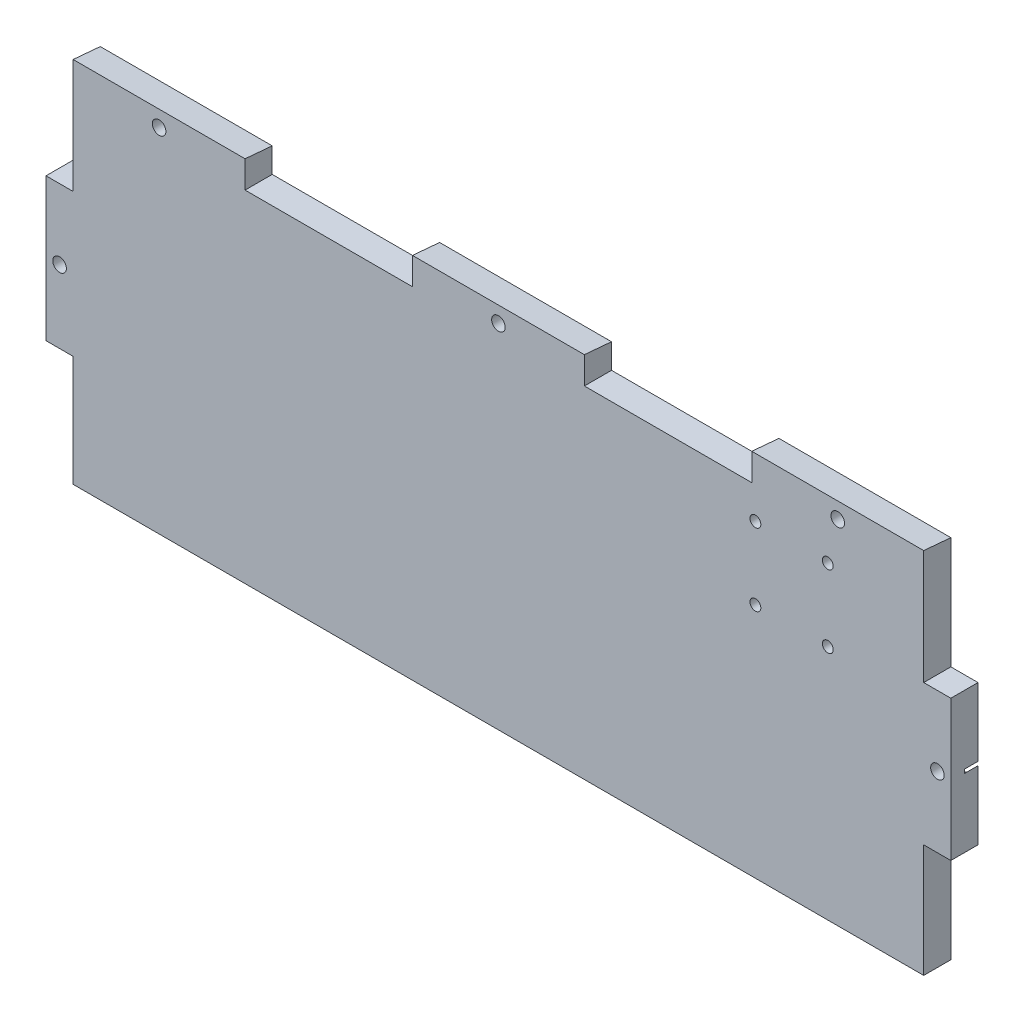
ISO-10303-21;
HEADER;
FILE_DESCRIPTION(('STEP AP214'),'2;1');
FILE_NAME('part.step','',(''),(''),'','','');
FILE_SCHEMA(('AUTOMOTIVE_DESIGN { 1 0 10303 214 1 1 1 1 }'));
ENDSEC;
DATA;
#1=APPLICATION_CONTEXT('core data for automotive mechanical design processes');
#2=APPLICATION_PROTOCOL_DEFINITION('international standard','automotive_design',2000,#1);
#3=PRODUCT_CONTEXT('',#1,'mechanical');
#4=PRODUCT('Part','Part','',(#3));
#5=PRODUCT_RELATED_PRODUCT_CATEGORY('part','',(#4));
#6=PRODUCT_DEFINITION_FORMATION('','',#4);
#7=PRODUCT_DEFINITION_CONTEXT('part definition',#1,'design');
#8=PRODUCT_DEFINITION('design','',#6,#7);
#9=PRODUCT_DEFINITION_SHAPE('','',#8);
#10=(LENGTH_UNIT() NAMED_UNIT(*) SI_UNIT(.MILLI.,.METRE.));
#11=(NAMED_UNIT(*) PLANE_ANGLE_UNIT() SI_UNIT($,.RADIAN.));
#12=(NAMED_UNIT(*) SI_UNIT($,.STERADIAN.) SOLID_ANGLE_UNIT());
#13=UNCERTAINTY_MEASURE_WITH_UNIT(LENGTH_MEASURE(1.E-05),#10,'distance_accuracy_value','');
#14=(GEOMETRIC_REPRESENTATION_CONTEXT(3) GLOBAL_UNCERTAINTY_ASSIGNED_CONTEXT((#13)) GLOBAL_UNIT_ASSIGNED_CONTEXT((#10,
#11,#12)) REPRESENTATION_CONTEXT('',''));
#15=CARTESIAN_POINT('',(0.,0.,0.));
#16=DIRECTION('',(0.,0.,1.));
#17=DIRECTION('',(1.,0.,0.));
#18=AXIS2_PLACEMENT_3D('',#15,#16,#17);
#19=CARTESIAN_POINT('',(-679.157205454483,81.33,6.));
#20=DIRECTION('',(0.,-0.996194698091746,0.0871557427476549));
#21=DIRECTION('',(0.,-0.0871557427476549,-0.996194698091746));
#22=AXIS2_PLACEMENT_3D('',#19,#20,#21);
#23=PLANE('',#22);
#24=DIRECTION('',(-1.,0.,0.));
#25=VECTOR('',#24,1.);
#26=CARTESIAN_POINT('',(0.,81.33,6.));
#27=LINE('',#26,#25);
#28=CARTESIAN_POINT('',(-75.,81.33,6.));
#29=VERTEX_POINT('',#28);
#30=CARTESIAN_POINT('',(-113.,81.33,6.));
#31=VERTEX_POINT('',#30);
#32=EDGE_CURVE('E435',#29,#31,#27,.T.);
#33=ORIENTED_EDGE('',*,*,#32,.F.);
#34=DIRECTION('',(0.,-0.0871557427476549,-0.996194698091746));
#35=VECTOR('',#34,1.);
#36=CARTESIAN_POINT('',(-75.,81.33,6.));
#37=LINE('',#36,#35);
#38=CARTESIAN_POINT('',(-75.,80.8050680188445,0.));
#39=VERTEX_POINT('',#38);
#40=EDGE_CURVE('E258',#29,#39,#37,.T.);
#41=ORIENTED_EDGE('',*,*,#40,.T.);
#42=DIRECTION('',(1.,0.,0.));
#43=VECTOR('',#42,1.);
#44=CARTESIAN_POINT('',(0.,80.8050680188444,0.));
#45=LINE('',#44,#43);
#46=CARTESIAN_POINT('',(-113.,80.8050680188445,0.));
#47=VERTEX_POINT('',#46);
#48=EDGE_CURVE('E454',#47,#39,#45,.T.);
#49=ORIENTED_EDGE('',*,*,#48,.F.);
#50=DIRECTION('',(0.,0.0871557427476549,0.996194698091746));
#51=VECTOR('',#50,1.);
#52=CARTESIAN_POINT('',(-113.,81.33,6.));
#53=LINE('',#52,#51);
#54=EDGE_CURVE('E249',#47,#31,#53,.T.);
#55=ORIENTED_EDGE('',*,*,#54,.T.);
#56=EDGE_LOOP('',(#33,#41,#49,#55));
#57=FACE_BOUND('',#56,.T.);
#58=ADVANCED_FACE('F35',(#57),#23,.F.);
#59=CARTESIAN_POINT('',(-150.,81.33,6.));
#60=VERTEX_POINT('',#59);
#61=CARTESIAN_POINT('',(-188.,81.33,6.));
#62=VERTEX_POINT('',#61);
#63=EDGE_CURVE('E436',#60,#62,#27,.T.);
#64=ORIENTED_EDGE('',*,*,#63,.F.);
#65=DIRECTION('',(0.,-0.0871557427476549,-0.996194698091746));
#66=VECTOR('',#65,1.);
#67=CARTESIAN_POINT('',(-150.,81.33,6.00000000000021));
#68=LINE('',#67,#66);
#69=CARTESIAN_POINT('',(-150.,80.8050680188445,0.));
#70=VERTEX_POINT('',#69);
#71=EDGE_CURVE('E252',#60,#70,#68,.T.);
#72=ORIENTED_EDGE('',*,*,#71,.T.);
#73=CARTESIAN_POINT('',(-188.,80.8050680188445,0.));
#74=VERTEX_POINT('',#73);
#75=EDGE_CURVE('E253',#74,#70,#45,.T.);
#76=ORIENTED_EDGE('',*,*,#75,.F.);
#77=DIRECTION('',(0.,-0.0871557427476549,-0.996194698091746));
#78=VECTOR('',#77,1.);
#79=CARTESIAN_POINT('',(-188.,80.7122072762415,-1.06140314482546));
#80=LINE('',#79,#78);
#81=EDGE_CURVE('E464',#62,#74,#80,.T.);
#82=ORIENTED_EDGE('',*,*,#81,.F.);
#83=EDGE_LOOP('',(#64,#72,#76,#82));
#84=FACE_BOUND('',#83,.T.);
#85=ADVANCED_FACE('F512',(#84),#23,.F.);
#86=CARTESIAN_POINT('',(0.,0.,6.));
#87=DIRECTION('',(-1.,0.,0.));
#88=DIRECTION('',(0.,0.,1.));
#89=AXIS2_PLACEMENT_3D('',#86,#87,#88);
#90=PLANE('',#89);
#91=DIRECTION('',(0.,0.,1.));
#92=VECTOR('',#91,1.);
#93=CARTESIAN_POINT('',(0.,56.0675340094222,6.));
#94=LINE('',#93,#92);
#95=CARTESIAN_POINT('',(0.,56.0675340094222,0.));
#96=VERTEX_POINT('',#95);
#97=CARTESIAN_POINT('',(0.,56.0675340094222,6.));
#98=VERTEX_POINT('',#97);
#99=EDGE_CURVE('E224',#96,#98,#94,.T.);
#100=ORIENTED_EDGE('',*,*,#99,.F.);
#101=DIRECTION('',(0.,1.,0.));
#102=VECTOR('',#101,1.);
#103=CARTESIAN_POINT('',(0.,0.,0.));
#104=LINE('',#103,#102);
#105=CARTESIAN_POINT('',(0.,80.8050680188444,0.));
#106=VERTEX_POINT('',#105);
#107=EDGE_CURVE('E402',#96,#106,#104,.T.);
#108=ORIENTED_EDGE('',*,*,#107,.T.);
#109=DIRECTION('',(0.,0.0871557427476549,0.996194698091746));
#110=VECTOR('',#109,1.);
#111=CARTESIAN_POINT('',(0.,80.7122072762415,-1.06140314482546));
#112=LINE('',#111,#110);
#113=CARTESIAN_POINT('',(0.,81.33,6.));
#114=VERTEX_POINT('',#113);
#115=EDGE_CURVE('E407',#106,#114,#112,.T.);
#116=ORIENTED_EDGE('',*,*,#115,.T.);
#117=DIRECTION('',(0.,1.,0.));
#118=VECTOR('',#117,1.);
#119=CARTESIAN_POINT('',(0.,0.,6.));
#120=LINE('',#119,#118);
#121=EDGE_CURVE('E226',#98,#114,#120,.T.);
#122=ORIENTED_EDGE('',*,*,#121,.F.);
#123=EDGE_LOOP('',(#100,#108,#116,#122));
#124=FACE_BOUND('',#123,.T.);
#125=ADVANCED_FACE('F37',(#124),#90,.F.);
#126=DIRECTION('',(0.,0.,-1.));
#127=VECTOR('',#126,1.);
#128=CARTESIAN_POINT('',(0.,25.,6.));
#129=LINE('',#128,#127);
#130=CARTESIAN_POINT('',(0.,25.,6.));
#131=VERTEX_POINT('',#130);
#132=CARTESIAN_POINT('',(0.,25.,0.));
#133=VERTEX_POINT('',#132);
#134=EDGE_CURVE('E220',#131,#133,#129,.T.);
#135=ORIENTED_EDGE('',*,*,#134,.F.);
#136=CARTESIAN_POINT('',(0.,0.,6.));
#137=VERTEX_POINT('',#136);
#138=EDGE_CURVE('E391',#137,#131,#120,.T.);
#139=ORIENTED_EDGE('',*,*,#138,.F.);
#140=DIRECTION('',(0.,0.,-1.));
#141=VECTOR('',#140,1.);
#142=CARTESIAN_POINT('',(0.,0.,6.));
#143=LINE('',#142,#141);
#144=CARTESIAN_POINT('',(0.,0.,0.));
#145=VERTEX_POINT('',#144);
#146=EDGE_CURVE('E447',#137,#145,#143,.T.);
#147=ORIENTED_EDGE('',*,*,#146,.T.);
#148=EDGE_CURVE('E396',#145,#133,#104,.T.);
#149=ORIENTED_EDGE('',*,*,#148,.T.);
#150=EDGE_LOOP('',(#135,#139,#147,#149));
#151=FACE_BOUND('',#150,.T.);
#152=ADVANCED_FACE('F450',(#151),#90,.F.);
#153=CARTESIAN_POINT('',(-188.,0.,6.));
#154=DIRECTION('',(1.,0.,0.));
#155=DIRECTION('',(0.,0.,-1.));
#156=AXIS2_PLACEMENT_3D('',#153,#154,#155);
#157=PLANE('',#156);
#158=DIRECTION('',(0.,0.,1.));
#159=VECTOR('',#158,1.);
#160=CARTESIAN_POINT('',(-188.,24.5,6.));
#161=LINE('',#160,#159);
#162=CARTESIAN_POINT('',(-188.,24.5,0.));
#163=VERTEX_POINT('',#162);
#164=CARTESIAN_POINT('',(-188.,24.5,6.));
#165=VERTEX_POINT('',#164);
#166=EDGE_CURVE('E479',#163,#165,#161,.T.);
#167=ORIENTED_EDGE('',*,*,#166,.F.);
#168=DIRECTION('',(0.,-1.,0.));
#169=VECTOR('',#168,1.);
#170=CARTESIAN_POINT('',(-188.,0.,0.));
#171=LINE('',#170,#169);
#172=CARTESIAN_POINT('',(-188.,0.,0.));
#173=VERTEX_POINT('',#172);
#174=EDGE_CURVE('E401',#163,#173,#171,.T.);
#175=ORIENTED_EDGE('',*,*,#174,.T.);
#176=DIRECTION('',(0.,0.,-1.));
#177=VECTOR('',#176,1.);
#178=CARTESIAN_POINT('',(-188.,0.,6.));
#179=LINE('',#178,#177);
#180=CARTESIAN_POINT('',(-188.,0.,6.));
#181=VERTEX_POINT('',#180);
#182=EDGE_CURVE('E449',#181,#173,#179,.T.);
#183=ORIENTED_EDGE('',*,*,#182,.F.);
#184=DIRECTION('',(0.,-1.,0.));
#185=VECTOR('',#184,1.);
#186=CARTESIAN_POINT('',(-188.,0.,6.));
#187=LINE('',#186,#185);
#188=EDGE_CURVE('E426',#165,#181,#187,.T.);
#189=ORIENTED_EDGE('',*,*,#188,.F.);
#190=EDGE_LOOP('',(#167,#175,#183,#189));
#191=FACE_BOUND('',#190,.T.);
#192=ADVANCED_FACE('F566',(#191),#157,.F.);
#193=DIRECTION('',(0.,0.,-1.));
#194=VECTOR('',#193,1.);
#195=CARTESIAN_POINT('',(-188.,56.0675340094222,6.));
#196=LINE('',#195,#194);
#197=CARTESIAN_POINT('',(-188.,56.0675340094222,6.));
#198=VERTEX_POINT('',#197);
#199=CARTESIAN_POINT('',(-188.,56.0675340094222,0.));
#200=VERTEX_POINT('',#199);
#201=EDGE_CURVE('E237',#198,#200,#196,.T.);
#202=ORIENTED_EDGE('',*,*,#201,.F.);
#203=EDGE_CURVE('E428',#62,#198,#187,.T.);
#204=ORIENTED_EDGE('',*,*,#203,.F.);
#205=ORIENTED_EDGE('',*,*,#81,.T.);
#206=EDGE_CURVE('E404',#74,#200,#171,.T.);
#207=ORIENTED_EDGE('',*,*,#206,.T.);
#208=EDGE_LOOP('',(#202,#204,#205,#207));
#209=FACE_BOUND('',#208,.T.);
#210=ADVANCED_FACE('F506',(#209),#157,.F.);
#211=CARTESIAN_POINT('',(0.,0.,6.));
#212=DIRECTION('',(0.,1.,0.));
#213=DIRECTION('',(-1.,0.,0.));
#214=AXIS2_PLACEMENT_3D('',#211,#212,#213);
#215=PLANE('',#214);
#216=DIRECTION('',(1.,0.,0.));
#217=VECTOR('',#216,1.);
#218=CARTESIAN_POINT('',(0.,0.,0.));
#219=LINE('',#218,#217);
#220=EDGE_CURVE('E398',#173,#145,#219,.T.);
#221=ORIENTED_EDGE('',*,*,#220,.T.);
#222=ORIENTED_EDGE('',*,*,#146,.F.);
#223=DIRECTION('',(1.,0.,0.));
#224=VECTOR('',#223,1.);
#225=CARTESIAN_POINT('',(0.,0.,6.));
#226=LINE('',#225,#224);
#227=EDGE_CURVE('E416',#181,#137,#226,.T.);
#228=ORIENTED_EDGE('',*,*,#227,.F.);
#229=ORIENTED_EDGE('',*,*,#182,.T.);
#230=EDGE_LOOP('',(#221,#222,#228,#229));
#231=FACE_BOUND('',#230,.T.);
#232=ADVANCED_FACE('F445',(#231),#215,.F.);
#233=CARTESIAN_POINT('',(0.,0.,6.));
#234=DIRECTION('',(0.,0.,1.));
#235=DIRECTION('',(1.,0.,0.));
#236=AXIS2_PLACEMENT_3D('',#233,#234,#235);
#237=PLANE('',#236);
#238=CARTESIAN_POINT('',(-37.2,52.33,6.));
#239=DIRECTION('',(0.,0.,1.));
#240=DIRECTION('',(1.,0.,0.));
#241=AXIS2_PLACEMENT_3D('',#238,#239,#240);
#242=CIRCLE('',#241,1.2);
#243=CARTESIAN_POINT('',(-36.,52.33,6.));
#244=VERTEX_POINT('',#243);
#245=EDGE_CURVE('E301',#244,#244,#242,.T.);
#246=ORIENTED_EDGE('',*,*,#245,.F.);
#247=EDGE_LOOP('',(#246));
#248=FACE_BOUND('',#247,.T.);
#249=CARTESIAN_POINT('',(-37.2,68.33,6.));
#250=DIRECTION('',(0.,0.,1.));
#251=DIRECTION('',(1.,0.,0.));
#252=AXIS2_PLACEMENT_3D('',#249,#250,#251);
#253=CIRCLE('',#252,1.2);
#254=CARTESIAN_POINT('',(-36.,68.33,6.));
#255=VERTEX_POINT('',#254);
#256=EDGE_CURVE('E291',#255,#255,#253,.T.);
#257=ORIENTED_EDGE('',*,*,#256,.F.);
#258=EDGE_LOOP('',(#257));
#259=FACE_BOUND('',#258,.T.);
#260=CARTESIAN_POINT('',(-21.2,52.33,6.));
#261=DIRECTION('',(0.,0.,1.));
#262=DIRECTION('',(1.,0.,0.));
#263=AXIS2_PLACEMENT_3D('',#260,#261,#262);
#264=CIRCLE('',#263,1.2);
#265=CARTESIAN_POINT('',(-20.,52.33,6.));
#266=VERTEX_POINT('',#265);
#267=EDGE_CURVE('E288',#266,#266,#264,.T.);
#268=ORIENTED_EDGE('',*,*,#267,.F.);
#269=EDGE_LOOP('',(#268));
#270=FACE_BOUND('',#269,.T.);
#271=CARTESIAN_POINT('',(-21.2,68.33,6.));
#272=DIRECTION('',(0.,0.,1.));
#273=DIRECTION('',(1.,0.,0.));
#274=AXIS2_PLACEMENT_3D('',#271,#272,#273);
#275=CIRCLE('',#274,1.20000000000001);
#276=CARTESIAN_POINT('',(-20.,68.33,6.));
#277=VERTEX_POINT('',#276);
#278=EDGE_CURVE('E285',#277,#277,#275,.T.);
#279=ORIENTED_EDGE('',*,*,#278,.F.);
#280=EDGE_LOOP('',(#279));
#281=FACE_BOUND('',#280,.T.);
#282=CARTESIAN_POINT('',(-191.,40.5675340094222,6.));
#283=DIRECTION('',(0.,0.,-1.));
#284=DIRECTION('',(-1.,0.,0.));
#285=AXIS2_PLACEMENT_3D('',#282,#283,#284);
#286=CIRCLE('',#285,1.5);
#287=CARTESIAN_POINT('',(-192.5,40.5675340094222,6.));
#288=VERTEX_POINT('',#287);
#289=EDGE_CURVE('E281',#288,#288,#286,.T.);
#290=ORIENTED_EDGE('',*,*,#289,.T.);
#291=EDGE_LOOP('',(#290));
#292=FACE_BOUND('',#291,.T.);
#293=CARTESIAN_POINT('',(-169.,77.8050680188445,6.));
#294=DIRECTION('',(0.,0.,-1.));
#295=DIRECTION('',(-1.,0.,0.));
#296=AXIS2_PLACEMENT_3D('',#293,#294,#295);
#297=CIRCLE('',#296,1.5);
#298=CARTESIAN_POINT('',(-170.5,77.8050680188445,6.));
#299=VERTEX_POINT('',#298);
#300=EDGE_CURVE('E277',#299,#299,#297,.T.);
#301=ORIENTED_EDGE('',*,*,#300,.T.);
#302=EDGE_LOOP('',(#301));
#303=FACE_BOUND('',#302,.T.);
#304=CARTESIAN_POINT('',(-94.,77.8050680188445,6.));
#305=DIRECTION('',(0.,0.,-1.));
#306=DIRECTION('',(-1.,0.,0.));
#307=AXIS2_PLACEMENT_3D('',#304,#305,#306);
#308=CIRCLE('',#307,1.5);
#309=CARTESIAN_POINT('',(-95.5,77.8050680188445,6.));
#310=VERTEX_POINT('',#309);
#311=EDGE_CURVE('E273',#310,#310,#308,.T.);
#312=ORIENTED_EDGE('',*,*,#311,.T.);
#313=EDGE_LOOP('',(#312));
#314=FACE_BOUND('',#313,.T.);
#315=CARTESIAN_POINT('',(-19.,77.8050680188445,6.));
#316=DIRECTION('',(0.,0.,-1.));
#317=DIRECTION('',(-1.,0.,0.));
#318=AXIS2_PLACEMENT_3D('',#315,#316,#317);
#319=CIRCLE('',#318,1.5);
#320=CARTESIAN_POINT('',(-20.5,77.8050680188445,6.));
#321=VERTEX_POINT('',#320);
#322=EDGE_CURVE('E269',#321,#321,#319,.T.);
#323=ORIENTED_EDGE('',*,*,#322,.T.);
#324=EDGE_LOOP('',(#323));
#325=FACE_BOUND('',#324,.T.);
#326=CARTESIAN_POINT('',(3.03401441182416,40.5675340094222,6.));
#327=DIRECTION('',(0.,0.,-1.));
#328=DIRECTION('',(-1.,0.,0.));
#329=AXIS2_PLACEMENT_3D('',#326,#327,#328);
#330=CIRCLE('',#329,1.5);
#331=CARTESIAN_POINT('',(1.53401441182416,40.5675340094222,6.));
#332=VERTEX_POINT('',#331);
#333=EDGE_CURVE('E265',#332,#332,#330,.T.);
#334=ORIENTED_EDGE('',*,*,#333,.T.);
#335=EDGE_LOOP('',(#334));
#336=FACE_BOUND('',#335,.T.);
#337=DIRECTION('',(0.,-1.,0.));
#338=VECTOR('',#337,1.);
#339=CARTESIAN_POINT('',(-75.,81.33,6.));
#340=LINE('',#339,#338);
#341=CARTESIAN_POINT('',(-75.,75.33,6.));
#342=VERTEX_POINT('',#341);
#343=EDGE_CURVE('E339',#29,#342,#340,.T.);
#344=ORIENTED_EDGE('',*,*,#343,.F.);
#345=ORIENTED_EDGE('',*,*,#32,.T.);
#346=DIRECTION('',(0.,1.,0.));
#347=VECTOR('',#346,1.);
#348=CARTESIAN_POINT('',(-113.,81.33,6.));
#349=LINE('',#348,#347);
#350=CARTESIAN_POINT('',(-113.,75.33,6.));
#351=VERTEX_POINT('',#350);
#352=EDGE_CURVE('E366',#351,#31,#349,.T.);
#353=ORIENTED_EDGE('',*,*,#352,.F.);
#354=DIRECTION('',(1.,0.,0.));
#355=VECTOR('',#354,1.);
#356=CARTESIAN_POINT('',(-150.,75.33,6.));
#357=LINE('',#356,#355);
#358=CARTESIAN_POINT('',(-150.,75.33,6.));
#359=VERTEX_POINT('',#358);
#360=EDGE_CURVE('E375',#359,#351,#357,.T.);
#361=ORIENTED_EDGE('',*,*,#360,.F.);
#362=DIRECTION('',(0.,-1.,0.));
#363=VECTOR('',#362,1.);
#364=CARTESIAN_POINT('',(-150.,81.33,6.));
#365=LINE('',#364,#363);
#366=EDGE_CURVE('E360',#60,#359,#365,.T.);
#367=ORIENTED_EDGE('',*,*,#366,.F.);
#368=ORIENTED_EDGE('',*,*,#63,.T.);
#369=ORIENTED_EDGE('',*,*,#203,.T.);
#370=DIRECTION('',(1.,0.,0.));
#371=VECTOR('',#370,1.);
#372=CARTESIAN_POINT('',(-194.,56.0675340094222,6.));
#373=LINE('',#372,#371);
#374=CARTESIAN_POINT('',(-194.,56.0675340094222,6.));
#375=VERTEX_POINT('',#374);
#376=EDGE_CURVE('E466',#375,#198,#373,.T.);
#377=ORIENTED_EDGE('',*,*,#376,.F.);
#378=DIRECTION('',(0.,1.,0.));
#379=VECTOR('',#378,1.);
#380=CARTESIAN_POINT('',(-194.,56.0675340094222,6.));
#381=LINE('',#380,#379);
#382=CARTESIAN_POINT('',(-194.,24.5,6.));
#383=VERTEX_POINT('',#382);
#384=EDGE_CURVE('E483',#383,#375,#381,.T.);
#385=ORIENTED_EDGE('',*,*,#384,.F.);
#386=DIRECTION('',(1.,0.,0.));
#387=VECTOR('',#386,1.);
#388=CARTESIAN_POINT('',(-194.,24.5,6.));
#389=LINE('',#388,#387);
#390=EDGE_CURVE('E485',#383,#165,#389,.T.);
#391=ORIENTED_EDGE('',*,*,#390,.T.);
#392=ORIENTED_EDGE('',*,*,#188,.T.);
#393=ORIENTED_EDGE('',*,*,#227,.T.);
#394=ORIENTED_EDGE('',*,*,#138,.T.);
#395=DIRECTION('',(-1.,0.,0.));
#396=VECTOR('',#395,1.);
#397=CARTESIAN_POINT('',(6.,25.,6.));
#398=LINE('',#397,#396);
#399=CARTESIAN_POINT('',(6.,25.,6.));
#400=VERTEX_POINT('',#399);
#401=EDGE_CURVE('E232',#400,#131,#398,.T.);
#402=ORIENTED_EDGE('',*,*,#401,.F.);
#403=DIRECTION('',(0.,-1.,0.));
#404=VECTOR('',#403,1.);
#405=CARTESIAN_POINT('',(6.,25.,6.));
#406=LINE('',#405,#404);
#407=CARTESIAN_POINT('',(6.,56.0675340094222,6.));
#408=VERTEX_POINT('',#407);
#409=EDGE_CURVE('E209',#408,#400,#406,.T.);
#410=ORIENTED_EDGE('',*,*,#409,.F.);
#411=DIRECTION('',(-1.,0.,0.));
#412=VECTOR('',#411,1.);
#413=CARTESIAN_POINT('',(6.,56.0675340094222,6.));
#414=LINE('',#413,#412);
#415=EDGE_CURVE('E214',#408,#98,#414,.T.);
#416=ORIENTED_EDGE('',*,*,#415,.T.);
#417=ORIENTED_EDGE('',*,*,#121,.T.);
#418=CARTESIAN_POINT('',(-38.,81.33,6.));
#419=VERTEX_POINT('',#418);
#420=EDGE_CURVE('E429',#114,#419,#27,.T.);
#421=ORIENTED_EDGE('',*,*,#420,.T.);
#422=DIRECTION('',(0.,1.,0.));
#423=VECTOR('',#422,1.);
#424=CARTESIAN_POINT('',(-38.,81.33,6.));
#425=LINE('',#424,#423);
#426=CARTESIAN_POINT('',(-38.,75.33,6.));
#427=VERTEX_POINT('',#426);
#428=EDGE_CURVE('E59',#427,#419,#425,.T.);
#429=ORIENTED_EDGE('',*,*,#428,.F.);
#430=DIRECTION('',(1.,0.,0.));
#431=VECTOR('',#430,1.);
#432=CARTESIAN_POINT('',(-75.,75.33,6.));
#433=LINE('',#432,#431);
#434=EDGE_CURVE('E354',#342,#427,#433,.T.);
#435=ORIENTED_EDGE('',*,*,#434,.F.);
#436=EDGE_LOOP('',(#344,#345,#353,#361,#367,#368,#369,#377,#385,#391,#392,#393,#394,#402,#410,
#416,#417,#421,#429,#435));
#437=FACE_BOUND('',#436,.T.);
#438=ADVANCED_FACE('F389',(#248,#259,#270,#281,#292,#303,#314,#325,#336,#437),#237,.T.);
#439=CARTESIAN_POINT('',(0.,0.,0.));
#440=DIRECTION('',(0.,0.,1.));
#441=DIRECTION('',(1.,0.,0.));
#442=AXIS2_PLACEMENT_3D('',#439,#440,#441);
#443=PLANE('',#442);
#444=CARTESIAN_POINT('',(-37.2,52.33,0.));
#445=DIRECTION('',(0.,0.,1.));
#446=DIRECTION('',(1.,0.,0.));
#447=AXIS2_PLACEMENT_3D('',#444,#445,#446);
#448=CIRCLE('',#447,1.2);
#449=CARTESIAN_POINT('',(-36.,52.33,0.));
#450=VERTEX_POINT('',#449);
#451=EDGE_CURVE('E39',#450,#450,#448,.T.);
#452=ORIENTED_EDGE('',*,*,#451,.T.);
#453=EDGE_LOOP('',(#452));
#454=FACE_BOUND('',#453,.T.);
#455=CARTESIAN_POINT('',(-37.2,68.33,0.));
#456=DIRECTION('',(0.,0.,1.));
#457=DIRECTION('',(1.,0.,0.));
#458=AXIS2_PLACEMENT_3D('',#455,#456,#457);
#459=CIRCLE('',#458,1.2);
#460=CARTESIAN_POINT('',(-36.,68.33,0.));
#461=VERTEX_POINT('',#460);
#462=EDGE_CURVE('E289',#461,#461,#459,.T.);
#463=ORIENTED_EDGE('',*,*,#462,.T.);
#464=EDGE_LOOP('',(#463));
#465=FACE_BOUND('',#464,.T.);
#466=CARTESIAN_POINT('',(-21.2,52.33,0.));
#467=DIRECTION('',(0.,0.,1.));
#468=DIRECTION('',(1.,0.,0.));
#469=AXIS2_PLACEMENT_3D('',#466,#467,#468);
#470=CIRCLE('',#469,1.2);
#471=CARTESIAN_POINT('',(-20.,52.33,0.));
#472=VERTEX_POINT('',#471);
#473=EDGE_CURVE('E286',#472,#472,#470,.T.);
#474=ORIENTED_EDGE('',*,*,#473,.T.);
#475=EDGE_LOOP('',(#474));
#476=FACE_BOUND('',#475,.T.);
#477=CARTESIAN_POINT('',(-21.2,68.33,0.));
#478=DIRECTION('',(0.,0.,1.));
#479=DIRECTION('',(1.,0.,0.));
#480=AXIS2_PLACEMENT_3D('',#477,#478,#479);
#481=CIRCLE('',#480,1.20000000000001);
#482=CARTESIAN_POINT('',(-20.,68.33,0.));
#483=VERTEX_POINT('',#482);
#484=EDGE_CURVE('E282',#483,#483,#481,.T.);
#485=ORIENTED_EDGE('',*,*,#484,.T.);
#486=EDGE_LOOP('',(#485));
#487=FACE_BOUND('',#486,.T.);
#488=CARTESIAN_POINT('',(-191.,40.5675340094222,0.));
#489=DIRECTION('',(0.,0.,-1.));
#490=DIRECTION('',(-1.,0.,0.));
#491=AXIS2_PLACEMENT_3D('',#488,#489,#490);
#492=CIRCLE('',#491,2.995);
#493=CARTESIAN_POINT('',(-193.995,40.5675340094222,0.));
#494=VERTEX_POINT('',#493);
#495=EDGE_CURVE('E316',#494,#494,#492,.T.);
#496=ORIENTED_EDGE('',*,*,#495,.F.);
#497=EDGE_LOOP('',(#496));
#498=FACE_BOUND('',#497,.T.);
#499=CARTESIAN_POINT('',(-169.,77.8050680188445,0.));
#500=DIRECTION('',(0.,0.,-1.));
#501=DIRECTION('',(-1.,0.,0.));
#502=AXIS2_PLACEMENT_3D('',#499,#500,#501);
#503=CIRCLE('',#502,2.995);
#504=CARTESIAN_POINT('',(-171.995,77.8050680188445,0.));
#505=VERTEX_POINT('',#504);
#506=EDGE_CURVE('E321',#505,#505,#503,.T.);
#507=ORIENTED_EDGE('',*,*,#506,.F.);
#508=EDGE_LOOP('',(#507));
#509=FACE_BOUND('',#508,.T.);
#510=CARTESIAN_POINT('',(-19.,77.8050680188445,0.));
#511=DIRECTION('',(0.,0.,-1.));
#512=DIRECTION('',(-1.,0.,0.));
#513=AXIS2_PLACEMENT_3D('',#510,#511,#512);
#514=CIRCLE('',#513,2.995);
#515=CARTESIAN_POINT('',(-21.995,77.8050680188445,0.));
#516=VERTEX_POINT('',#515);
#517=EDGE_CURVE('E327',#516,#516,#514,.T.);
#518=ORIENTED_EDGE('',*,*,#517,.F.);
#519=EDGE_LOOP('',(#518));
#520=FACE_BOUND('',#519,.T.);
#521=CARTESIAN_POINT('',(-94.,77.8050680188445,0.));
#522=DIRECTION('',(0.,0.,-1.));
#523=DIRECTION('',(-1.,0.,0.));
#524=AXIS2_PLACEMENT_3D('',#521,#522,#523);
#525=CIRCLE('',#524,2.995);
#526=CARTESIAN_POINT('',(-96.995,77.8050680188445,0.));
#527=VERTEX_POINT('',#526);
#528=EDGE_CURVE('E333',#527,#527,#525,.T.);
#529=ORIENTED_EDGE('',*,*,#528,.F.);
#530=EDGE_LOOP('',(#529));
#531=FACE_BOUND('',#530,.T.);
#532=DIRECTION('',(0.,1.,0.));
#533=VECTOR('',#532,1.);
#534=CARTESIAN_POINT('',(6.,25.,0.));
#535=LINE('',#534,#533);
#536=CARTESIAN_POINT('',(6.,40.9834119851954,0.));
#537=VERTEX_POINT('',#536);
#538=CARTESIAN_POINT('',(6.,56.0675340094222,0.));
#539=VERTEX_POINT('',#538);
#540=EDGE_CURVE('E197',#537,#539,#535,.T.);
#541=ORIENTED_EDGE('',*,*,#540,.F.);
#542=CARTESIAN_POINT('',(3.03401441182416,40.5675340094222,0.));
#543=DIRECTION('',(0.,0.,-1.));
#544=DIRECTION('',(-1.,0.,0.));
#545=AXIS2_PLACEMENT_3D('',#542,#543,#544);
#546=CIRCLE('',#545,2.995);
#547=CARTESIAN_POINT('',(6.,40.151656033649,0.));
#548=VERTEX_POINT('',#547);
#549=EDGE_CURVE('E185',#548,#537,#546,.T.);
#550=ORIENTED_EDGE('',*,*,#549,.F.);
#551=CARTESIAN_POINT('',(6.,25.,0.));
#552=VERTEX_POINT('',#551);
#553=EDGE_CURVE('E205',#552,#548,#535,.T.);
#554=ORIENTED_EDGE('',*,*,#553,.F.);
#555=DIRECTION('',(-1.,0.,0.));
#556=VECTOR('',#555,1.);
#557=CARTESIAN_POINT('',(6.,25.,0.));
#558=LINE('',#557,#556);
#559=EDGE_CURVE('E229',#552,#133,#558,.T.);
#560=ORIENTED_EDGE('',*,*,#559,.T.);
#561=ORIENTED_EDGE('',*,*,#148,.F.);
#562=ORIENTED_EDGE('',*,*,#220,.F.);
#563=ORIENTED_EDGE('',*,*,#174,.F.);
#564=DIRECTION('',(1.,0.,0.));
#565=VECTOR('',#564,1.);
#566=CARTESIAN_POINT('',(-194.,24.5,0.));
#567=LINE('',#566,#565);
#568=CARTESIAN_POINT('',(-194.,24.5,0.));
#569=VERTEX_POINT('',#568);
#570=EDGE_CURVE('E488',#569,#163,#567,.T.);
#571=ORIENTED_EDGE('',*,*,#570,.F.);
#572=DIRECTION('',(0.,-1.,0.));
#573=VECTOR('',#572,1.);
#574=CARTESIAN_POINT('',(-194.,56.0675340094222,0.));
#575=LINE('',#574,#573);
#576=CARTESIAN_POINT('',(-194.,56.0675340094222,0.));
#577=VERTEX_POINT('',#576);
#578=EDGE_CURVE('E574',#577,#569,#575,.T.);
#579=ORIENTED_EDGE('',*,*,#578,.F.);
#580=DIRECTION('',(1.,0.,0.));
#581=VECTOR('',#580,1.);
#582=CARTESIAN_POINT('',(-194.,56.0675340094222,0.));
#583=LINE('',#582,#581);
#584=EDGE_CURVE('E471',#577,#200,#583,.T.);
#585=ORIENTED_EDGE('',*,*,#584,.T.);
#586=ORIENTED_EDGE('',*,*,#206,.F.);
#587=ORIENTED_EDGE('',*,*,#75,.T.);
#588=DIRECTION('',(0.,-1.,0.));
#589=VECTOR('',#588,1.);
#590=CARTESIAN_POINT('',(-150.,81.33,0.));
#591=LINE('',#590,#589);
#592=CARTESIAN_POINT('',(-150.,75.33,0.));
#593=VERTEX_POINT('',#592);
#594=EDGE_CURVE('E362',#70,#593,#591,.T.);
#595=ORIENTED_EDGE('',*,*,#594,.T.);
#596=DIRECTION('',(1.,0.,0.));
#597=VECTOR('',#596,1.);
#598=CARTESIAN_POINT('',(-150.,75.33,0.));
#599=LINE('',#598,#597);
#600=CARTESIAN_POINT('',(-113.,75.33,0.));
#601=VERTEX_POINT('',#600);
#602=EDGE_CURVE('E365',#593,#601,#599,.T.);
#603=ORIENTED_EDGE('',*,*,#602,.T.);
#604=DIRECTION('',(0.,1.,0.));
#605=VECTOR('',#604,1.);
#606=CARTESIAN_POINT('',(-113.,81.33,0.));
#607=LINE('',#606,#605);
#608=EDGE_CURVE('E369',#601,#47,#607,.T.);
#609=ORIENTED_EDGE('',*,*,#608,.T.);
#610=ORIENTED_EDGE('',*,*,#48,.T.);
#611=DIRECTION('',(0.,-1.,0.));
#612=VECTOR('',#611,1.);
#613=CARTESIAN_POINT('',(-75.,81.33,0.));
#614=LINE('',#613,#612);
#615=CARTESIAN_POINT('',(-75.,75.33,0.));
#616=VERTEX_POINT('',#615);
#617=EDGE_CURVE('E342',#39,#616,#614,.T.);
#618=ORIENTED_EDGE('',*,*,#617,.T.);
#619=DIRECTION('',(1.,0.,0.));
#620=VECTOR('',#619,1.);
#621=CARTESIAN_POINT('',(-75.,75.33,0.));
#622=LINE('',#621,#620);
#623=CARTESIAN_POINT('',(-38.,75.33,0.));
#624=VERTEX_POINT('',#623);
#625=EDGE_CURVE('E345',#616,#624,#622,.T.);
#626=ORIENTED_EDGE('',*,*,#625,.T.);
#627=DIRECTION('',(0.,1.,0.));
#628=VECTOR('',#627,1.);
#629=CARTESIAN_POINT('',(-38.,81.33,0.));
#630=LINE('',#629,#628);
#631=CARTESIAN_POINT('',(-38.,80.8050680188445,0.));
#632=VERTEX_POINT('',#631);
#633=EDGE_CURVE('E348',#624,#632,#630,.T.);
#634=ORIENTED_EDGE('',*,*,#633,.T.);
#635=EDGE_CURVE('E451',#632,#106,#45,.T.);
#636=ORIENTED_EDGE('',*,*,#635,.T.);
#637=ORIENTED_EDGE('',*,*,#107,.F.);
#638=DIRECTION('',(-1.,0.,0.));
#639=VECTOR('',#638,1.);
#640=CARTESIAN_POINT('',(6.,56.0675340094222,0.));
#641=LINE('',#640,#639);
#642=EDGE_CURVE('E203',#539,#96,#641,.T.);
#643=ORIENTED_EDGE('',*,*,#642,.F.);
#644=EDGE_LOOP('',(#541,#550,#554,#560,#561,#562,#563,#571,#579,#585,#586,#587,#595,#603,#609,
#610,#618,#626,#634,#636,#637,#643));
#645=FACE_BOUND('',#644,.T.);
#646=ADVANCED_FACE('F200',(#454,#465,#476,#487,#498,#509,#520,#531,#645),#443,.F.);
#647=ORIENTED_EDGE('',*,*,#635,.F.);
#648=DIRECTION('',(0.,0.0871557427476549,0.996194698091746));
#649=VECTOR('',#648,1.);
#650=CARTESIAN_POINT('',(-38.,81.33,6.));
#651=LINE('',#650,#649);
#652=EDGE_CURVE('E256',#632,#419,#651,.T.);
#653=ORIENTED_EDGE('',*,*,#652,.T.);
#654=ORIENTED_EDGE('',*,*,#420,.F.);
#655=ORIENTED_EDGE('',*,*,#115,.F.);
#656=EDGE_LOOP('',(#647,#653,#654,#655));
#657=FACE_BOUND('',#656,.T.);
#658=ADVANCED_FACE('F463',(#657),#23,.F.);
#659=CARTESIAN_POINT('',(-194.,56.0675340094222,6.));
#660=DIRECTION('',(0.,-1.,0.));
#661=DIRECTION('',(0.,0.,-1.));
#662=AXIS2_PLACEMENT_3D('',#659,#660,#661);
#663=PLANE('',#662);
#664=ORIENTED_EDGE('',*,*,#201,.T.);
#665=ORIENTED_EDGE('',*,*,#584,.F.);
#666=DIRECTION('',(0.,0.,-1.));
#667=VECTOR('',#666,1.);
#668=CARTESIAN_POINT('',(-194.,56.0675340094222,6.));
#669=LINE('',#668,#667);
#670=EDGE_CURVE('E577',#375,#577,#669,.T.);
#671=ORIENTED_EDGE('',*,*,#670,.F.);
#672=ORIENTED_EDGE('',*,*,#376,.T.);
#673=EDGE_LOOP('',(#664,#665,#671,#672));
#674=FACE_BOUND('',#673,.T.);
#675=ADVANCED_FACE('F503',(#674),#663,.F.);
#676=CARTESIAN_POINT('',(-194.,24.5,6.));
#677=DIRECTION('',(0.,1.,0.));
#678=DIRECTION('',(0.,0.,1.));
#679=AXIS2_PLACEMENT_3D('',#676,#677,#678);
#680=PLANE('',#679);
#681=ORIENTED_EDGE('',*,*,#166,.T.);
#682=ORIENTED_EDGE('',*,*,#390,.F.);
#683=DIRECTION('',(0.,0.,1.));
#684=VECTOR('',#683,1.);
#685=CARTESIAN_POINT('',(-194.,24.5,6.));
#686=LINE('',#685,#684);
#687=EDGE_CURVE('E489',#569,#383,#686,.T.);
#688=ORIENTED_EDGE('',*,*,#687,.F.);
#689=ORIENTED_EDGE('',*,*,#570,.T.);
#690=EDGE_LOOP('',(#681,#682,#688,#689));
#691=FACE_BOUND('',#690,.T.);
#692=ADVANCED_FACE('F555',(#691),#680,.F.);
#693=CARTESIAN_POINT('',(-194.,0.,0.));
#694=DIRECTION('',(1.,0.,0.));
#695=DIRECTION('',(0.,0.,-1.));
#696=AXIS2_PLACEMENT_3D('',#693,#694,#695);
#697=PLANE('',#696);
#698=ORIENTED_EDGE('',*,*,#384,.T.);
#699=ORIENTED_EDGE('',*,*,#670,.T.);
#700=ORIENTED_EDGE('',*,*,#578,.T.);
#701=ORIENTED_EDGE('',*,*,#687,.T.);
#702=EDGE_LOOP('',(#698,#699,#700,#701));
#703=FACE_BOUND('',#702,.T.);
#704=ADVANCED_FACE('F580',(#703),#697,.F.);
#705=CARTESIAN_POINT('',(6.,25.,6.));
#706=DIRECTION('',(0.,1.,0.));
#707=DIRECTION('',(0.,0.,1.));
#708=AXIS2_PLACEMENT_3D('',#705,#706,#707);
#709=PLANE('',#708);
#710=ORIENTED_EDGE('',*,*,#134,.T.);
#711=ORIENTED_EDGE('',*,*,#559,.F.);
#712=DIRECTION('',(0.,0.,-1.));
#713=VECTOR('',#712,1.);
#714=CARTESIAN_POINT('',(6.,25.,6.));
#715=LINE('',#714,#713);
#716=EDGE_CURVE('E206',#400,#552,#715,.T.);
#717=ORIENTED_EDGE('',*,*,#716,.F.);
#718=ORIENTED_EDGE('',*,*,#401,.T.);
#719=EDGE_LOOP('',(#710,#711,#717,#718));
#720=FACE_BOUND('',#719,.T.);
#721=ADVANCED_FACE('F393',(#720),#709,.F.);
#722=CARTESIAN_POINT('',(6.,56.0675340094222,6.));
#723=DIRECTION('',(0.,-1.,0.));
#724=DIRECTION('',(0.,0.,-1.));
#725=AXIS2_PLACEMENT_3D('',#722,#723,#724);
#726=PLANE('',#725);
#727=ORIENTED_EDGE('',*,*,#99,.T.);
#728=ORIENTED_EDGE('',*,*,#415,.F.);
#729=DIRECTION('',(0.,0.,1.));
#730=VECTOR('',#729,1.);
#731=CARTESIAN_POINT('',(6.,56.0675340094222,6.));
#732=LINE('',#731,#730);
#733=EDGE_CURVE('E208',#539,#408,#732,.T.);
#734=ORIENTED_EDGE('',*,*,#733,.F.);
#735=ORIENTED_EDGE('',*,*,#642,.T.);
#736=EDGE_LOOP('',(#727,#728,#734,#735));
#737=FACE_BOUND('',#736,.T.);
#738=ADVANCED_FACE('F587',(#737),#726,.F.);
#739=CARTESIAN_POINT('',(6.,0.,0.));
#740=DIRECTION('',(-1.,0.,0.));
#741=DIRECTION('',(0.,0.,1.));
#742=AXIS2_PLACEMENT_3D('',#739,#740,#741);
#743=PLANE('',#742);
#744=DIRECTION('',(0.,-1.,0.));
#745=VECTOR('',#744,1.);
#746=CARTESIAN_POINT('',(6.,0.,3.));
#747=LINE('',#746,#745);
#748=CARTESIAN_POINT('',(6.,40.9834119851954,3.));
#749=VERTEX_POINT('',#748);
#750=CARTESIAN_POINT('',(6.,40.151656033649,3.));
#751=VERTEX_POINT('',#750);
#752=EDGE_CURVE('E199',#749,#751,#747,.T.);
#753=ORIENTED_EDGE('',*,*,#752,.F.);
#754=DIRECTION('',(0.,0.,-1.));
#755=VECTOR('',#754,1.);
#756=CARTESIAN_POINT('',(6.,40.9834119851954,3.));
#757=LINE('',#756,#755);
#758=EDGE_CURVE('E11',#749,#537,#757,.T.);
#759=ORIENTED_EDGE('',*,*,#758,.T.);
#760=ORIENTED_EDGE('',*,*,#540,.T.);
#761=ORIENTED_EDGE('',*,*,#733,.T.);
#762=ORIENTED_EDGE('',*,*,#409,.T.);
#763=ORIENTED_EDGE('',*,*,#716,.T.);
#764=ORIENTED_EDGE('',*,*,#553,.T.);
#765=DIRECTION('',(0.,0.,-1.));
#766=VECTOR('',#765,1.);
#767=CARTESIAN_POINT('',(6.,40.151656033649,3.));
#768=LINE('',#767,#766);
#769=EDGE_CURVE('E44',#548,#751,#768,.F.);
#770=ORIENTED_EDGE('',*,*,#769,.T.);
#771=EDGE_LOOP('',(#753,#759,#760,#761,#762,#763,#764,#770));
#772=FACE_BOUND('',#771,.T.);
#773=ADVANCED_FACE('F196',(#772),#743,.F.);
#774=CARTESIAN_POINT('',(-150.,81.33,0.));
#775=DIRECTION('',(-1.,0.,0.));
#776=DIRECTION('',(0.,-1.,0.));
#777=AXIS2_PLACEMENT_3D('',#774,#775,#776);
#778=PLANE('',#777);
#779=ORIENTED_EDGE('',*,*,#366,.T.);
#780=DIRECTION('',(0.,0.,1.));
#781=VECTOR('',#780,1.);
#782=CARTESIAN_POINT('',(-150.,75.33,0.));
#783=LINE('',#782,#781);
#784=EDGE_CURVE('E372',#593,#359,#783,.T.);
#785=ORIENTED_EDGE('',*,*,#784,.F.);
#786=ORIENTED_EDGE('',*,*,#594,.F.);
#787=ORIENTED_EDGE('',*,*,#71,.F.);
#788=EDGE_LOOP('',(#779,#785,#786,#787));
#789=FACE_BOUND('',#788,.T.);
#790=ADVANCED_FACE('F514',(#789),#778,.F.);
#791=CARTESIAN_POINT('',(-113.,81.33,0.));
#792=DIRECTION('',(1.,0.,0.));
#793=DIRECTION('',(0.,0.,-1.));
#794=AXIS2_PLACEMENT_3D('',#791,#792,#793);
#795=PLANE('',#794);
#796=ORIENTED_EDGE('',*,*,#608,.F.);
#797=DIRECTION('',(0.,0.,1.));
#798=VECTOR('',#797,1.);
#799=CARTESIAN_POINT('',(-113.,75.33,0.));
#800=LINE('',#799,#798);
#801=EDGE_CURVE('E225',#601,#351,#800,.T.);
#802=ORIENTED_EDGE('',*,*,#801,.T.);
#803=ORIENTED_EDGE('',*,*,#352,.T.);
#804=ORIENTED_EDGE('',*,*,#54,.F.);
#805=EDGE_LOOP('',(#796,#802,#803,#804));
#806=FACE_BOUND('',#805,.T.);
#807=ADVANCED_FACE('F522',(#806),#795,.F.);
#808=CARTESIAN_POINT('',(-150.,75.33,0.));
#809=DIRECTION('',(0.,-1.,0.));
#810=DIRECTION('',(1.,0.,0.));
#811=AXIS2_PLACEMENT_3D('',#808,#809,#810);
#812=PLANE('',#811);
#813=ORIENTED_EDGE('',*,*,#360,.T.);
#814=ORIENTED_EDGE('',*,*,#801,.F.);
#815=ORIENTED_EDGE('',*,*,#602,.F.);
#816=ORIENTED_EDGE('',*,*,#784,.T.);
#817=EDGE_LOOP('',(#813,#814,#815,#816));
#818=FACE_BOUND('',#817,.T.);
#819=ADVANCED_FACE('F519',(#818),#812,.F.);
#820=CARTESIAN_POINT('',(-75.,81.33,0.));
#821=DIRECTION('',(-1.,0.,0.));
#822=DIRECTION('',(0.,0.,1.));
#823=AXIS2_PLACEMENT_3D('',#820,#821,#822);
#824=PLANE('',#823);
#825=ORIENTED_EDGE('',*,*,#343,.T.);
#826=DIRECTION('',(0.,0.,1.));
#827=VECTOR('',#826,1.);
#828=CARTESIAN_POINT('',(-75.,75.33,0.));
#829=LINE('',#828,#827);
#830=EDGE_CURVE('E351',#616,#342,#829,.T.);
#831=ORIENTED_EDGE('',*,*,#830,.F.);
#832=ORIENTED_EDGE('',*,*,#617,.F.);
#833=ORIENTED_EDGE('',*,*,#40,.F.);
#834=EDGE_LOOP('',(#825,#831,#832,#833));
#835=FACE_BOUND('',#834,.T.);
#836=ADVANCED_FACE('F527',(#835),#824,.F.);
#837=CARTESIAN_POINT('',(-38.,81.33,0.));
#838=DIRECTION('',(1.,0.,0.));
#839=DIRECTION('',(0.,0.,-1.));
#840=AXIS2_PLACEMENT_3D('',#837,#838,#839);
#841=PLANE('',#840);
#842=ORIENTED_EDGE('',*,*,#633,.F.);
#843=DIRECTION('',(0.,0.,1.));
#844=VECTOR('',#843,1.);
#845=CARTESIAN_POINT('',(-38.,75.33,0.));
#846=LINE('',#845,#844);
#847=EDGE_CURVE('E358',#624,#427,#846,.T.);
#848=ORIENTED_EDGE('',*,*,#847,.T.);
#849=ORIENTED_EDGE('',*,*,#428,.T.);
#850=ORIENTED_EDGE('',*,*,#652,.F.);
#851=EDGE_LOOP('',(#842,#848,#849,#850));
#852=FACE_BOUND('',#851,.T.);
#853=ADVANCED_FACE('F531',(#852),#841,.F.);
#854=CARTESIAN_POINT('',(-75.,75.33,0.));
#855=DIRECTION('',(0.,-1.,0.));
#856=DIRECTION('',(1.,0.,0.));
#857=AXIS2_PLACEMENT_3D('',#854,#855,#856);
#858=PLANE('',#857);
#859=ORIENTED_EDGE('',*,*,#434,.T.);
#860=ORIENTED_EDGE('',*,*,#847,.F.);
#861=ORIENTED_EDGE('',*,*,#625,.F.);
#862=ORIENTED_EDGE('',*,*,#830,.T.);
#863=EDGE_LOOP('',(#859,#860,#861,#862));
#864=FACE_BOUND('',#863,.T.);
#865=ADVANCED_FACE('F530',(#864),#858,.F.);
#866=CARTESIAN_POINT('',(-94.,77.8050680188445,3.));
#867=DIRECTION('',(0.,0.,-1.));
#868=DIRECTION('',(-1.,0.,0.));
#869=AXIS2_PLACEMENT_3D('',#866,#867,#868);
#870=CYLINDRICAL_SURFACE('',#869,2.995);
#871=CARTESIAN_POINT('',(-94.,77.8050680188445,3.));
#872=DIRECTION('',(0.,0.,-1.));
#873=DIRECTION('',(-1.,0.,0.));
#874=AXIS2_PLACEMENT_3D('',#871,#872,#873);
#875=CIRCLE('',#874,2.995);
#876=CARTESIAN_POINT('',(-96.995,77.8050680188445,3.));
#877=VERTEX_POINT('',#876);
#878=EDGE_CURVE('E336',#877,#877,#875,.T.);
#879=ORIENTED_EDGE('',*,*,#878,.F.);
#880=EDGE_LOOP('',(#879));
#881=FACE_BOUND('',#880,.T.);
#882=ORIENTED_EDGE('',*,*,#528,.T.);
#883=EDGE_LOOP('',(#882));
#884=FACE_BOUND('',#883,.T.);
#885=ADVANCED_FACE('F538',(#881,#884),#870,.F.);
#886=CARTESIAN_POINT('',(-94.,77.8050680188445,3.));
#887=DIRECTION('',(0.,0.,-1.));
#888=DIRECTION('',(-1.,0.,0.));
#889=AXIS2_PLACEMENT_3D('',#886,#887,#888);
#890=PLANE('',#889);
#891=CARTESIAN_POINT('',(-94.,77.8050680188445,3.));
#892=DIRECTION('',(0.,0.,-1.));
#893=DIRECTION('',(-1.,0.,0.));
#894=AXIS2_PLACEMENT_3D('',#891,#892,#893);
#895=CIRCLE('',#894,1.5);
#896=CARTESIAN_POINT('',(-95.5,77.8050680188445,3.));
#897=VERTEX_POINT('',#896);
#898=EDGE_CURVE('E270',#897,#897,#895,.T.);
#899=ORIENTED_EDGE('',*,*,#898,.F.);
#900=EDGE_LOOP('',(#899));
#901=FACE_BOUND('',#900,.T.);
#902=ORIENTED_EDGE('',*,*,#878,.T.);
#903=EDGE_LOOP('',(#902));
#904=FACE_BOUND('',#903,.T.);
#905=ADVANCED_FACE('F637',(#901,#904),#890,.T.);
#906=CARTESIAN_POINT('',(-19.,77.8050680188445,3.));
#907=DIRECTION('',(0.,0.,-1.));
#908=DIRECTION('',(-1.,0.,0.));
#909=AXIS2_PLACEMENT_3D('',#906,#907,#908);
#910=CYLINDRICAL_SURFACE('',#909,2.995);
#911=CARTESIAN_POINT('',(-19.,77.8050680188445,3.));
#912=DIRECTION('',(0.,0.,-1.));
#913=DIRECTION('',(-1.,0.,0.));
#914=AXIS2_PLACEMENT_3D('',#911,#912,#913);
#915=CIRCLE('',#914,2.995);
#916=CARTESIAN_POINT('',(-21.995,77.8050680188445,3.));
#917=VERTEX_POINT('',#916);
#918=EDGE_CURVE('E330',#917,#917,#915,.T.);
#919=ORIENTED_EDGE('',*,*,#918,.F.);
#920=EDGE_LOOP('',(#919));
#921=FACE_BOUND('',#920,.T.);
#922=ORIENTED_EDGE('',*,*,#517,.T.);
#923=EDGE_LOOP('',(#922));
#924=FACE_BOUND('',#923,.T.);
#925=ADVANCED_FACE('F644',(#921,#924),#910,.F.);
#926=CARTESIAN_POINT('',(-19.,77.8050680188445,3.));
#927=DIRECTION('',(0.,0.,-1.));
#928=DIRECTION('',(-1.,0.,0.));
#929=AXIS2_PLACEMENT_3D('',#926,#927,#928);
#930=PLANE('',#929);
#931=CARTESIAN_POINT('',(-19.,77.8050680188445,3.));
#932=DIRECTION('',(0.,0.,-1.));
#933=DIRECTION('',(-1.,0.,0.));
#934=AXIS2_PLACEMENT_3D('',#931,#932,#933);
#935=CIRCLE('',#934,1.5);
#936=CARTESIAN_POINT('',(-20.5,77.8050680188445,3.));
#937=VERTEX_POINT('',#936);
#938=EDGE_CURVE('E266',#937,#937,#935,.T.);
#939=ORIENTED_EDGE('',*,*,#938,.F.);
#940=EDGE_LOOP('',(#939));
#941=FACE_BOUND('',#940,.T.);
#942=ORIENTED_EDGE('',*,*,#918,.T.);
#943=EDGE_LOOP('',(#942));
#944=FACE_BOUND('',#943,.T.);
#945=ADVANCED_FACE('F649',(#941,#944),#930,.T.);
#946=CARTESIAN_POINT('',(-169.,77.8050680188445,3.));
#947=DIRECTION('',(0.,0.,-1.));
#948=DIRECTION('',(-1.,0.,0.));
#949=AXIS2_PLACEMENT_3D('',#946,#947,#948);
#950=CYLINDRICAL_SURFACE('',#949,2.995);
#951=CARTESIAN_POINT('',(-169.,77.8050680188445,3.));
#952=DIRECTION('',(0.,0.,-1.));
#953=DIRECTION('',(-1.,0.,0.));
#954=AXIS2_PLACEMENT_3D('',#951,#952,#953);
#955=CIRCLE('',#954,2.995);
#956=CARTESIAN_POINT('',(-171.995,77.8050680188445,3.));
#957=VERTEX_POINT('',#956);
#958=EDGE_CURVE('E324',#957,#957,#955,.T.);
#959=ORIENTED_EDGE('',*,*,#958,.F.);
#960=EDGE_LOOP('',(#959));
#961=FACE_BOUND('',#960,.T.);
#962=ORIENTED_EDGE('',*,*,#506,.T.);
#963=EDGE_LOOP('',(#962));
#964=FACE_BOUND('',#963,.T.);
#965=ADVANCED_FACE('F657',(#961,#964),#950,.F.);
#966=CARTESIAN_POINT('',(-169.,77.8050680188445,3.));
#967=DIRECTION('',(0.,0.,-1.));
#968=DIRECTION('',(-1.,0.,0.));
#969=AXIS2_PLACEMENT_3D('',#966,#967,#968);
#970=PLANE('',#969);
#971=CARTESIAN_POINT('',(-169.,77.8050680188445,3.));
#972=DIRECTION('',(0.,0.,-1.));
#973=DIRECTION('',(-1.,0.,0.));
#974=AXIS2_PLACEMENT_3D('',#971,#972,#973);
#975=CIRCLE('',#974,1.5);
#976=CARTESIAN_POINT('',(-170.5,77.8050680188445,3.));
#977=VERTEX_POINT('',#976);
#978=EDGE_CURVE('E274',#977,#977,#975,.T.);
#979=ORIENTED_EDGE('',*,*,#978,.F.);
#980=EDGE_LOOP('',(#979));
#981=FACE_BOUND('',#980,.T.);
#982=ORIENTED_EDGE('',*,*,#958,.T.);
#983=EDGE_LOOP('',(#982));
#984=FACE_BOUND('',#983,.T.);
#985=ADVANCED_FACE('F662',(#981,#984),#970,.T.);
#986=CARTESIAN_POINT('',(-191.,40.5675340094222,3.));
#987=DIRECTION('',(0.,0.,-1.));
#988=DIRECTION('',(-1.,0.,0.));
#989=AXIS2_PLACEMENT_3D('',#986,#987,#988);
#990=CYLINDRICAL_SURFACE('',#989,2.995);
#991=CARTESIAN_POINT('',(-191.,40.5675340094222,3.));
#992=DIRECTION('',(0.,0.,-1.));
#993=DIRECTION('',(-1.,0.,0.));
#994=AXIS2_PLACEMENT_3D('',#991,#992,#993);
#995=CIRCLE('',#994,2.995);
#996=CARTESIAN_POINT('',(-193.995,40.5675340094222,3.));
#997=VERTEX_POINT('',#996);
#998=EDGE_CURVE('E318',#997,#997,#995,.T.);
#999=ORIENTED_EDGE('',*,*,#998,.F.);
#1000=EDGE_LOOP('',(#999));
#1001=FACE_BOUND('',#1000,.T.);
#1002=ORIENTED_EDGE('',*,*,#495,.T.);
#1003=EDGE_LOOP('',(#1002));
#1004=FACE_BOUND('',#1003,.T.);
#1005=ADVANCED_FACE('F670',(#1001,#1004),#990,.F.);
#1006=CARTESIAN_POINT('',(-191.,40.5675340094222,3.));
#1007=DIRECTION('',(0.,0.,-1.));
#1008=DIRECTION('',(-1.,0.,0.));
#1009=AXIS2_PLACEMENT_3D('',#1006,#1007,#1008);
#1010=PLANE('',#1009);
#1011=CARTESIAN_POINT('',(-191.,40.5675340094222,3.));
#1012=DIRECTION('',(0.,0.,-1.));
#1013=DIRECTION('',(-1.,0.,0.));
#1014=AXIS2_PLACEMENT_3D('',#1011,#1012,#1013);
#1015=CIRCLE('',#1014,1.5);
#1016=CARTESIAN_POINT('',(-192.5,40.5675340094222,3.));
#1017=VERTEX_POINT('',#1016);
#1018=EDGE_CURVE('E278',#1017,#1017,#1015,.T.);
#1019=ORIENTED_EDGE('',*,*,#1018,.F.);
#1020=EDGE_LOOP('',(#1019));
#1021=FACE_BOUND('',#1020,.T.);
#1022=ORIENTED_EDGE('',*,*,#998,.T.);
#1023=EDGE_LOOP('',(#1022));
#1024=FACE_BOUND('',#1023,.T.);
#1025=ADVANCED_FACE('F675',(#1021,#1024),#1010,.T.);
#1026=CARTESIAN_POINT('',(3.03401441182416,40.5675340094222,3.));
#1027=DIRECTION('',(0.,0.,-1.));
#1028=DIRECTION('',(-1.,0.,0.));
#1029=AXIS2_PLACEMENT_3D('',#1026,#1027,#1028);
#1030=CYLINDRICAL_SURFACE('',#1029,2.995);
#1031=CARTESIAN_POINT('',(3.03401441182416,40.5675340094222,3.));
#1032=DIRECTION('',(0.,0.,-1.));
#1033=DIRECTION('',(-1.,0.,0.));
#1034=AXIS2_PLACEMENT_3D('',#1031,#1032,#1033);
#1035=CIRCLE('',#1034,2.995);
#1036=EDGE_CURVE('E51',#751,#749,#1035,.T.);
#1037=ORIENTED_EDGE('',*,*,#1036,.F.);
#1038=ORIENTED_EDGE('',*,*,#769,.F.);
#1039=ORIENTED_EDGE('',*,*,#549,.T.);
#1040=ORIENTED_EDGE('',*,*,#758,.F.);
#1041=EDGE_LOOP('',(#1037,#1038,#1039,#1040));
#1042=FACE_BOUND('',#1041,.T.);
#1043=ADVANCED_FACE('F186',(#1042),#1030,.F.);
#1044=CARTESIAN_POINT('',(3.03401441182416,40.5675340094222,3.));
#1045=DIRECTION('',(0.,0.,-1.));
#1046=DIRECTION('',(-1.,0.,0.));
#1047=AXIS2_PLACEMENT_3D('',#1044,#1045,#1046);
#1048=PLANE('',#1047);
#1049=CARTESIAN_POINT('',(3.03401441182416,40.5675340094222,3.));
#1050=DIRECTION('',(0.,0.,-1.));
#1051=DIRECTION('',(-1.,0.,0.));
#1052=AXIS2_PLACEMENT_3D('',#1049,#1050,#1051);
#1053=CIRCLE('',#1052,1.5);
#1054=CARTESIAN_POINT('',(1.53401441182416,40.5675340094222,3.));
#1055=VERTEX_POINT('',#1054);
#1056=EDGE_CURVE('E193',#1055,#1055,#1053,.T.);
#1057=ORIENTED_EDGE('',*,*,#1056,.F.);
#1058=EDGE_LOOP('',(#1057));
#1059=FACE_BOUND('',#1058,.T.);
#1060=ORIENTED_EDGE('',*,*,#752,.T.);
#1061=ORIENTED_EDGE('',*,*,#1036,.T.);
#1062=EDGE_LOOP('',(#1060,#1061));
#1063=FACE_BOUND('',#1062,.T.);
#1064=ADVANCED_FACE('F687',(#1059,#1063),#1048,.T.);
#1065=CARTESIAN_POINT('',(3.03401441182416,40.5675340094222,6.));
#1066=DIRECTION('',(0.,0.,-1.));
#1067=DIRECTION('',(-1.,0.,0.));
#1068=AXIS2_PLACEMENT_3D('',#1065,#1066,#1067);
#1069=CYLINDRICAL_SURFACE('',#1068,1.5);
#1070=ORIENTED_EDGE('',*,*,#1056,.T.);
#1071=EDGE_LOOP('',(#1070));
#1072=FACE_BOUND('',#1071,.T.);
#1073=ORIENTED_EDGE('',*,*,#333,.F.);
#1074=EDGE_LOOP('',(#1073));
#1075=FACE_BOUND('',#1074,.T.);
#1076=ADVANCED_FACE('F724',(#1072,#1075),#1069,.F.);
#1077=CARTESIAN_POINT('',(-19.,77.8050680188445,6.));
#1078=DIRECTION('',(0.,0.,-1.));
#1079=DIRECTION('',(-1.,0.,0.));
#1080=AXIS2_PLACEMENT_3D('',#1077,#1078,#1079);
#1081=CYLINDRICAL_SURFACE('',#1080,1.5);
#1082=ORIENTED_EDGE('',*,*,#938,.T.);
#1083=EDGE_LOOP('',(#1082));
#1084=FACE_BOUND('',#1083,.T.);
#1085=ORIENTED_EDGE('',*,*,#322,.F.);
#1086=EDGE_LOOP('',(#1085));
#1087=FACE_BOUND('',#1086,.T.);
#1088=ADVANCED_FACE('F734',(#1084,#1087),#1081,.F.);
#1089=CARTESIAN_POINT('',(-94.,77.8050680188445,6.));
#1090=DIRECTION('',(0.,0.,-1.));
#1091=DIRECTION('',(-1.,0.,0.));
#1092=AXIS2_PLACEMENT_3D('',#1089,#1090,#1091);
#1093=CYLINDRICAL_SURFACE('',#1092,1.5);
#1094=ORIENTED_EDGE('',*,*,#898,.T.);
#1095=EDGE_LOOP('',(#1094));
#1096=FACE_BOUND('',#1095,.T.);
#1097=ORIENTED_EDGE('',*,*,#311,.F.);
#1098=EDGE_LOOP('',(#1097));
#1099=FACE_BOUND('',#1098,.T.);
#1100=ADVANCED_FACE('F744',(#1096,#1099),#1093,.F.);
#1101=CARTESIAN_POINT('',(-169.,77.8050680188445,6.));
#1102=DIRECTION('',(0.,0.,-1.));
#1103=DIRECTION('',(-1.,0.,0.));
#1104=AXIS2_PLACEMENT_3D('',#1101,#1102,#1103);
#1105=CYLINDRICAL_SURFACE('',#1104,1.5);
#1106=ORIENTED_EDGE('',*,*,#978,.T.);
#1107=EDGE_LOOP('',(#1106));
#1108=FACE_BOUND('',#1107,.T.);
#1109=ORIENTED_EDGE('',*,*,#300,.F.);
#1110=EDGE_LOOP('',(#1109));
#1111=FACE_BOUND('',#1110,.T.);
#1112=ADVANCED_FACE('F754',(#1108,#1111),#1105,.F.);
#1113=CARTESIAN_POINT('',(-191.,40.5675340094222,6.));
#1114=DIRECTION('',(0.,0.,-1.));
#1115=DIRECTION('',(-1.,0.,0.));
#1116=AXIS2_PLACEMENT_3D('',#1113,#1114,#1115);
#1117=CYLINDRICAL_SURFACE('',#1116,1.5);
#1118=ORIENTED_EDGE('',*,*,#1018,.T.);
#1119=EDGE_LOOP('',(#1118));
#1120=FACE_BOUND('',#1119,.T.);
#1121=ORIENTED_EDGE('',*,*,#289,.F.);
#1122=EDGE_LOOP('',(#1121));
#1123=FACE_BOUND('',#1122,.T.);
#1124=ADVANCED_FACE('F764',(#1120,#1123),#1117,.F.);
#1125=CARTESIAN_POINT('',(-21.2,68.33,-4.));
#1126=DIRECTION('',(0.,0.,1.));
#1127=DIRECTION('',(1.,0.,0.));
#1128=AXIS2_PLACEMENT_3D('',#1125,#1126,#1127);
#1129=CYLINDRICAL_SURFACE('',#1128,1.20000000000001);
#1130=ORIENTED_EDGE('',*,*,#278,.T.);
#1131=EDGE_LOOP('',(#1130));
#1132=FACE_BOUND('',#1131,.T.);
#1133=ORIENTED_EDGE('',*,*,#484,.F.);
#1134=EDGE_LOOP('',(#1133));
#1135=FACE_BOUND('',#1134,.T.);
#1136=ADVANCED_FACE('F773',(#1132,#1135),#1129,.F.);
#1137=CARTESIAN_POINT('',(-21.2,52.33,-4.));
#1138=DIRECTION('',(0.,0.,1.));
#1139=DIRECTION('',(1.,0.,0.));
#1140=AXIS2_PLACEMENT_3D('',#1137,#1138,#1139);
#1141=CYLINDRICAL_SURFACE('',#1140,1.2);
#1142=ORIENTED_EDGE('',*,*,#267,.T.);
#1143=EDGE_LOOP('',(#1142));
#1144=FACE_BOUND('',#1143,.T.);
#1145=ORIENTED_EDGE('',*,*,#473,.F.);
#1146=EDGE_LOOP('',(#1145));
#1147=FACE_BOUND('',#1146,.T.);
#1148=ADVANCED_FACE('F883',(#1144,#1147),#1141,.F.);
#1149=CARTESIAN_POINT('',(-37.2,68.33,-4.));
#1150=DIRECTION('',(0.,0.,1.));
#1151=DIRECTION('',(1.,0.,0.));
#1152=AXIS2_PLACEMENT_3D('',#1149,#1150,#1151);
#1153=CYLINDRICAL_SURFACE('',#1152,1.2);
#1154=ORIENTED_EDGE('',*,*,#256,.T.);
#1155=EDGE_LOOP('',(#1154));
#1156=FACE_BOUND('',#1155,.T.);
#1157=ORIENTED_EDGE('',*,*,#462,.F.);
#1158=EDGE_LOOP('',(#1157));
#1159=FACE_BOUND('',#1158,.T.);
#1160=ADVANCED_FACE('F890',(#1156,#1159),#1153,.F.);
#1161=CARTESIAN_POINT('',(-37.2,52.33,-4.));
#1162=DIRECTION('',(0.,0.,1.));
#1163=DIRECTION('',(1.,0.,0.));
#1164=AXIS2_PLACEMENT_3D('',#1161,#1162,#1163);
#1165=CYLINDRICAL_SURFACE('',#1164,1.2);
#1166=ORIENTED_EDGE('',*,*,#245,.T.);
#1167=EDGE_LOOP('',(#1166));
#1168=FACE_BOUND('',#1167,.T.);
#1169=ORIENTED_EDGE('',*,*,#451,.F.);
#1170=EDGE_LOOP('',(#1169));
#1171=FACE_BOUND('',#1170,.T.);
#1172=ADVANCED_FACE('F898',(#1168,#1171),#1165,.F.);
#1173=CLOSED_SHELL('',(#58,#85,#125,#152,#192,#210,#232,#438,#646,#658,#675,#692,#704,#721,#738,
#773,#790,#807,#819,#836,#853,#865,#885,#905,#925,#945,#965,#985,#1005,#1025,#1043,#1064,#1076,
#1088,#1100,#1112,#1124,#1136,#1148,#1160,#1172));
#1174=MANIFOLD_SOLID_BREP('B2',#1173);
#1175=ADVANCED_BREP_SHAPE_REPRESENTATION('',(#18,#1174),#14);
#1176=SHAPE_DEFINITION_REPRESENTATION(#9,#1175);
ENDSEC;
END-ISO-10303-21;
